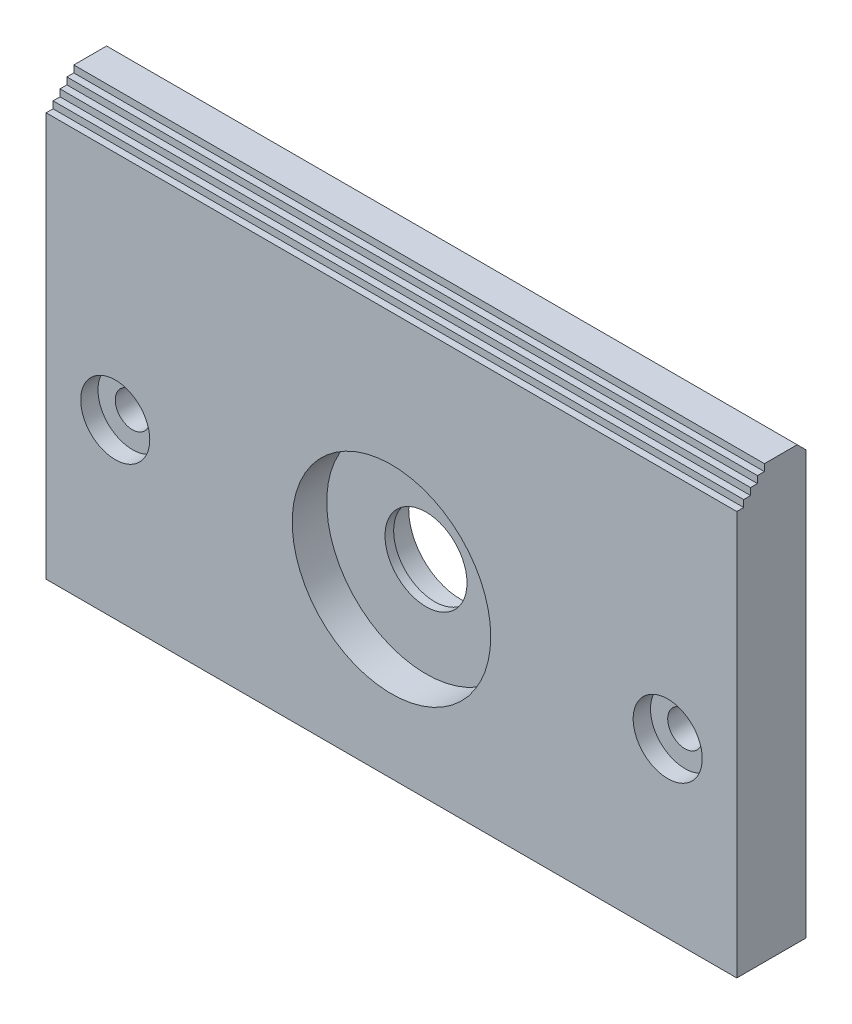
ISO-10303-21;
HEADER;
FILE_DESCRIPTION(('STEP AP214'),'2;1');
FILE_NAME('part.step','',(''),(''),'','','');
FILE_SCHEMA(('AUTOMOTIVE_DESIGN { 1 0 10303 214 1 1 1 1 }'));
ENDSEC;
DATA;
#1=APPLICATION_CONTEXT('core data for automotive mechanical design processes');
#2=APPLICATION_PROTOCOL_DEFINITION('international standard','automotive_design',2000,#1);
#3=PRODUCT_CONTEXT('',#1,'mechanical');
#4=PRODUCT('Part','Part','',(#3));
#5=PRODUCT_RELATED_PRODUCT_CATEGORY('part','',(#4));
#6=PRODUCT_DEFINITION_FORMATION('','',#4);
#7=PRODUCT_DEFINITION_CONTEXT('part definition',#1,'design');
#8=PRODUCT_DEFINITION('design','',#6,#7);
#9=PRODUCT_DEFINITION_SHAPE('','',#8);
#10=(LENGTH_UNIT() NAMED_UNIT(*) SI_UNIT(.MILLI.,.METRE.));
#11=(NAMED_UNIT(*) PLANE_ANGLE_UNIT() SI_UNIT($,.RADIAN.));
#12=(NAMED_UNIT(*) SI_UNIT($,.STERADIAN.) SOLID_ANGLE_UNIT());
#13=UNCERTAINTY_MEASURE_WITH_UNIT(LENGTH_MEASURE(1.E-05),#10,'distance_accuracy_value','');
#14=(GEOMETRIC_REPRESENTATION_CONTEXT(3) GLOBAL_UNCERTAINTY_ASSIGNED_CONTEXT((#13)) GLOBAL_UNIT_ASSIGNED_CONTEXT((#10,
#11,#12)) REPRESENTATION_CONTEXT('',''));
#15=CARTESIAN_POINT('',(0.,0.,0.));
#16=DIRECTION('',(0.,0.,1.));
#17=DIRECTION('',(1.,0.,0.));
#18=AXIS2_PLACEMENT_3D('',#15,#16,#17);
#19=CARTESIAN_POINT('',(40.,10.8333333333333,-0.0010000000000062));
#20=DIRECTION('',(0.,0.,1.));
#21=DIRECTION('',(1.,0.,0.));
#22=AXIS2_PLACEMENT_3D('',#19,#20,#21);
#23=CYLINDRICAL_SURFACE('',#22,4.75);
#24=CARTESIAN_POINT('',(40.,10.8333333333333,4.));
#25=DIRECTION('',(0.,0.,1.));
#26=DIRECTION('',(1.,0.,0.));
#27=AXIS2_PLACEMENT_3D('',#24,#25,#26);
#28=CIRCLE('',#27,4.75);
#29=CARTESIAN_POINT('',(44.75,10.8333333333333,4.));
#30=VERTEX_POINT('',#29);
#31=EDGE_CURVE('E296',#30,#30,#28,.F.);
#32=ORIENTED_EDGE('',*,*,#31,.F.);
#33=EDGE_LOOP('',(#32));
#34=FACE_BOUND('',#33,.T.);
#35=CARTESIAN_POINT('',(40.,10.8333333333333,3.));
#36=DIRECTION('',(0.,0.,-1.));
#37=DIRECTION('',(-1.,0.,0.));
#38=AXIS2_PLACEMENT_3D('',#35,#36,#37);
#39=CIRCLE('',#38,4.75);
#40=CARTESIAN_POINT('',(35.25,10.8333333333333,3.));
#41=VERTEX_POINT('',#40);
#42=EDGE_CURVE('E301',#41,#41,#39,.F.);
#43=ORIENTED_EDGE('',*,*,#42,.F.);
#44=EDGE_LOOP('',(#43));
#45=FACE_BOUND('',#44,.T.);
#46=ADVANCED_FACE('F163',(#34,#45),#23,.F.);
#47=CARTESIAN_POINT('',(80.,40.8333333333333,0.));
#48=DIRECTION('',(0.,1.,0.));
#49=DIRECTION('',(-1.,0.,0.));
#50=AXIS2_PLACEMENT_3D('',#47,#48,#49);
#51=PLANE('',#50);
#52=DIRECTION('',(-1.,0.,0.));
#53=VECTOR('',#52,1.);
#54=CARTESIAN_POINT('',(80.001,40.8333333333333,4.8));
#55=LINE('',#54,#53);
#56=CARTESIAN_POINT('',(80.,40.8333333333333,4.8));
#57=VERTEX_POINT('',#56);
#58=CARTESIAN_POINT('',(0.,40.8333333333333,4.8));
#59=VERTEX_POINT('',#58);
#60=EDGE_CURVE('E338',#57,#59,#55,.T.);
#61=ORIENTED_EDGE('',*,*,#60,.F.);
#62=DIRECTION('',(0.,0.,1.));
#63=VECTOR('',#62,1.);
#64=CARTESIAN_POINT('',(80.,40.8333333333333,0.));
#65=LINE('',#64,#63);
#66=CARTESIAN_POINT('',(80.,40.8333333333333,0.999999999999973));
#67=VERTEX_POINT('',#66);
#68=EDGE_CURVE('E293',#67,#57,#65,.T.);
#69=ORIENTED_EDGE('',*,*,#68,.F.);
#70=DIRECTION('',(-1.,0.,0.));
#71=VECTOR('',#70,1.);
#72=CARTESIAN_POINT('',(0.,40.8333333333333,0.999999999999973));
#73=LINE('',#72,#71);
#74=CARTESIAN_POINT('',(0.,40.8333333333333,0.999999999999973));
#75=VERTEX_POINT('',#74);
#76=EDGE_CURVE('E317',#67,#75,#73,.T.);
#77=ORIENTED_EDGE('',*,*,#76,.T.);
#78=DIRECTION('',(0.,0.,1.));
#79=VECTOR('',#78,1.);
#80=CARTESIAN_POINT('',(0.,40.8333333333333,0.));
#81=LINE('',#80,#79);
#82=EDGE_CURVE('E289',#75,#59,#81,.T.);
#83=ORIENTED_EDGE('',*,*,#82,.T.);
#84=EDGE_LOOP('',(#61,#69,#77,#83));
#85=FACE_BOUND('',#84,.T.);
#86=ADVANCED_FACE('F336',(#85),#51,.T.);
#87=CARTESIAN_POINT('',(0.,40.8333333333333,0.));
#88=DIRECTION('',(-1.,0.,0.));
#89=DIRECTION('',(0.,-1.,0.));
#90=AXIS2_PLACEMENT_3D('',#87,#88,#89);
#91=PLANE('',#90);
#92=DIRECTION('',(0.,0.,1.));
#93=VECTOR('',#92,1.);
#94=CARTESIAN_POINT('',(0.,37.6333333333333,7.2));
#95=LINE('',#94,#93);
#96=CARTESIAN_POINT('',(0.,37.6333333333333,7.2));
#97=VERTEX_POINT('',#96);
#98=CARTESIAN_POINT('',(0.,37.6333333333333,8.));
#99=VERTEX_POINT('',#98);
#100=EDGE_CURVE('E179',#97,#99,#95,.T.);
#101=ORIENTED_EDGE('',*,*,#100,.F.);
#102=DIRECTION('',(0.,-1.,0.));
#103=VECTOR('',#102,1.);
#104=CARTESIAN_POINT('',(0.,38.4333333333333,7.2));
#105=LINE('',#104,#103);
#106=CARTESIAN_POINT('',(0.,38.4333333333333,7.2));
#107=VERTEX_POINT('',#106);
#108=EDGE_CURVE('E346',#107,#97,#105,.T.);
#109=ORIENTED_EDGE('',*,*,#108,.F.);
#110=DIRECTION('',(0.,0.,1.));
#111=VECTOR('',#110,1.);
#112=CARTESIAN_POINT('',(0.,38.4333333333333,6.4));
#113=LINE('',#112,#111);
#114=CARTESIAN_POINT('',(0.,38.4333333333333,6.4));
#115=VERTEX_POINT('',#114);
#116=EDGE_CURVE('E400',#115,#107,#113,.T.);
#117=ORIENTED_EDGE('',*,*,#116,.F.);
#118=DIRECTION('',(0.,-1.,0.));
#119=VECTOR('',#118,1.);
#120=CARTESIAN_POINT('',(0.,39.2333333333333,6.4));
#121=LINE('',#120,#119);
#122=CARTESIAN_POINT('',(0.,39.2333333333333,6.4));
#123=VERTEX_POINT('',#122);
#124=EDGE_CURVE('E397',#123,#115,#121,.T.);
#125=ORIENTED_EDGE('',*,*,#124,.F.);
#126=DIRECTION('',(0.,0.,1.));
#127=VECTOR('',#126,1.);
#128=CARTESIAN_POINT('',(0.,39.2333333333333,5.6));
#129=LINE('',#128,#127);
#130=CARTESIAN_POINT('',(0.,39.2333333333333,5.6));
#131=VERTEX_POINT('',#130);
#132=EDGE_CURVE('E394',#131,#123,#129,.T.);
#133=ORIENTED_EDGE('',*,*,#132,.F.);
#134=DIRECTION('',(0.,-1.,0.));
#135=VECTOR('',#134,1.);
#136=CARTESIAN_POINT('',(0.,40.0333333333333,5.6));
#137=LINE('',#136,#135);
#138=CARTESIAN_POINT('',(0.,40.0333333333333,5.6));
#139=VERTEX_POINT('',#138);
#140=EDGE_CURVE('E388',#139,#131,#137,.T.);
#141=ORIENTED_EDGE('',*,*,#140,.F.);
#142=DIRECTION('',(0.,0.,1.));
#143=VECTOR('',#142,1.);
#144=CARTESIAN_POINT('',(0.,40.0333333333333,4.8));
#145=LINE('',#144,#143);
#146=CARTESIAN_POINT('',(0.,40.0333333333333,4.8));
#147=VERTEX_POINT('',#146);
#148=EDGE_CURVE('E385',#147,#139,#145,.T.);
#149=ORIENTED_EDGE('',*,*,#148,.F.);
#150=DIRECTION('',(0.,-1.,0.));
#151=VECTOR('',#150,1.);
#152=CARTESIAN_POINT('',(0.,40.8333333333333,4.8));
#153=LINE('',#152,#151);
#154=EDGE_CURVE('E270',#59,#147,#153,.T.);
#155=ORIENTED_EDGE('',*,*,#154,.F.);
#156=ORIENTED_EDGE('',*,*,#82,.F.);
#157=DIRECTION('',(0.,-0.707106781186552,-0.707106781186543));
#158=VECTOR('',#157,1.);
#159=CARTESIAN_POINT('',(0.,40.3333333333333,0.499999999999993));
#160=LINE('',#159,#158);
#161=CARTESIAN_POINT('',(0.,39.8333333333333,0.));
#162=VERTEX_POINT('',#161);
#163=EDGE_CURVE('E320',#75,#162,#160,.T.);
#164=ORIENTED_EDGE('',*,*,#163,.T.);
#165=DIRECTION('',(0.,-1.,0.));
#166=VECTOR('',#165,1.);
#167=CARTESIAN_POINT('',(0.,40.8333333333333,0.));
#168=LINE('',#167,#166);
#169=CARTESIAN_POINT('',(0.,-9.16666666666666,0.));
#170=VERTEX_POINT('',#169);
#171=EDGE_CURVE('E286',#162,#170,#168,.T.);
#172=ORIENTED_EDGE('',*,*,#171,.T.);
#173=DIRECTION('',(0.,0.,1.));
#174=VECTOR('',#173,1.);
#175=CARTESIAN_POINT('',(0.,-9.16666666666666,-0.000999999999999265));
#176=LINE('',#175,#174);
#177=CARTESIAN_POINT('',(0.,-9.16666666666666,8.));
#178=VERTEX_POINT('',#177);
#179=EDGE_CURVE('E355',#170,#178,#176,.T.);
#180=ORIENTED_EDGE('',*,*,#179,.T.);
#181=DIRECTION('',(0.,-1.,0.));
#182=VECTOR('',#181,1.);
#183=CARTESIAN_POINT('',(0.,40.8333333333333,8.));
#184=LINE('',#183,#182);
#185=EDGE_CURVE('E277',#99,#178,#184,.T.);
#186=ORIENTED_EDGE('',*,*,#185,.F.);
#187=EDGE_LOOP('',(#101,#109,#117,#125,#133,#141,#149,#155,#156,#164,#172,#180,#186));
#188=FACE_BOUND('',#187,.T.);
#189=ADVANCED_FACE('F381',(#188),#91,.T.);
#190=CARTESIAN_POINT('',(80.,-19.1666666666667,0.));
#191=DIRECTION('',(1.,0.,0.));
#192=DIRECTION('',(0.,0.,-1.));
#193=AXIS2_PLACEMENT_3D('',#190,#191,#192);
#194=PLANE('',#193);
#195=DIRECTION('',(0.,0.,1.));
#196=VECTOR('',#195,1.);
#197=CARTESIAN_POINT('',(80.,37.6333333333333,7.2));
#198=LINE('',#197,#196);
#199=CARTESIAN_POINT('',(80.,37.6333333333333,7.2));
#200=VERTEX_POINT('',#199);
#201=CARTESIAN_POINT('',(80.,37.6333333333333,8.));
#202=VERTEX_POINT('',#201);
#203=EDGE_CURVE('E259',#200,#202,#198,.T.);
#204=ORIENTED_EDGE('',*,*,#203,.T.);
#205=DIRECTION('',(0.,1.,0.));
#206=VECTOR('',#205,1.);
#207=CARTESIAN_POINT('',(80.,-19.1666666666667,8.));
#208=LINE('',#207,#206);
#209=CARTESIAN_POINT('',(80.,-9.16666666666666,8.));
#210=VERTEX_POINT('',#209);
#211=EDGE_CURVE('E187',#210,#202,#208,.T.);
#212=ORIENTED_EDGE('',*,*,#211,.F.);
#213=DIRECTION('',(0.,0.,1.));
#214=VECTOR('',#213,1.);
#215=CARTESIAN_POINT('',(80.,-9.16666666666666,-0.000999999999999265));
#216=LINE('',#215,#214);
#217=CARTESIAN_POINT('',(80.,-9.16666666666666,0.));
#218=VERTEX_POINT('',#217);
#219=EDGE_CURVE('E354',#218,#210,#216,.T.);
#220=ORIENTED_EDGE('',*,*,#219,.F.);
#221=DIRECTION('',(0.,1.,0.));
#222=VECTOR('',#221,1.);
#223=CARTESIAN_POINT('',(80.,-19.1666666666667,0.));
#224=LINE('',#223,#222);
#225=CARTESIAN_POINT('',(80.,39.8333333333334,0.));
#226=VERTEX_POINT('',#225);
#227=EDGE_CURVE('E280',#218,#226,#224,.T.);
#228=ORIENTED_EDGE('',*,*,#227,.T.);
#229=DIRECTION('',(0.,0.707106781186552,0.707106781186543));
#230=VECTOR('',#229,1.);
#231=CARTESIAN_POINT('',(80.,10.3333333333329,-29.5));
#232=LINE('',#231,#230);
#233=EDGE_CURVE('E12',#226,#67,#232,.T.);
#234=ORIENTED_EDGE('',*,*,#233,.T.);
#235=ORIENTED_EDGE('',*,*,#68,.T.);
#236=DIRECTION('',(0.,-1.,0.));
#237=VECTOR('',#236,1.);
#238=CARTESIAN_POINT('',(80.,40.8333333333333,4.8));
#239=LINE('',#238,#237);
#240=CARTESIAN_POINT('',(80.,40.0333333333333,4.8));
#241=VERTEX_POINT('',#240);
#242=EDGE_CURVE('E263',#57,#241,#239,.T.);
#243=ORIENTED_EDGE('',*,*,#242,.T.);
#244=DIRECTION('',(0.,0.,1.));
#245=VECTOR('',#244,1.);
#246=CARTESIAN_POINT('',(80.,40.0333333333333,4.8));
#247=LINE('',#246,#245);
#248=CARTESIAN_POINT('',(80.,40.0333333333333,5.6));
#249=VERTEX_POINT('',#248);
#250=EDGE_CURVE('E431',#241,#249,#247,.T.);
#251=ORIENTED_EDGE('',*,*,#250,.T.);
#252=DIRECTION('',(0.,-1.,0.));
#253=VECTOR('',#252,1.);
#254=CARTESIAN_POINT('',(80.,40.0333333333333,5.6));
#255=LINE('',#254,#253);
#256=CARTESIAN_POINT('',(80.,39.2333333333333,5.6));
#257=VERTEX_POINT('',#256);
#258=EDGE_CURVE('E419',#249,#257,#255,.T.);
#259=ORIENTED_EDGE('',*,*,#258,.T.);
#260=DIRECTION('',(0.,0.,1.));
#261=VECTOR('',#260,1.);
#262=CARTESIAN_POINT('',(80.,39.2333333333333,5.6));
#263=LINE('',#262,#261);
#264=CARTESIAN_POINT('',(80.,39.2333333333333,6.4));
#265=VERTEX_POINT('',#264);
#266=EDGE_CURVE('E429',#257,#265,#263,.T.);
#267=ORIENTED_EDGE('',*,*,#266,.T.);
#268=DIRECTION('',(0.,-1.,0.));
#269=VECTOR('',#268,1.);
#270=CARTESIAN_POINT('',(80.,39.2333333333333,6.4));
#271=LINE('',#270,#269);
#272=CARTESIAN_POINT('',(80.,38.4333333333333,6.4));
#273=VERTEX_POINT('',#272);
#274=EDGE_CURVE('E433',#265,#273,#271,.T.);
#275=ORIENTED_EDGE('',*,*,#274,.T.);
#276=DIRECTION('',(0.,0.,1.));
#277=VECTOR('',#276,1.);
#278=CARTESIAN_POINT('',(80.,38.4333333333333,6.4));
#279=LINE('',#278,#277);
#280=CARTESIAN_POINT('',(80.,38.4333333333333,7.2));
#281=VERTEX_POINT('',#280);
#282=EDGE_CURVE('E438',#273,#281,#279,.T.);
#283=ORIENTED_EDGE('',*,*,#282,.T.);
#284=DIRECTION('',(0.,-1.,0.));
#285=VECTOR('',#284,1.);
#286=CARTESIAN_POINT('',(80.,38.4333333333333,7.2));
#287=LINE('',#286,#285);
#288=EDGE_CURVE('E269',#281,#200,#287,.T.);
#289=ORIENTED_EDGE('',*,*,#288,.T.);
#290=EDGE_LOOP('',(#204,#212,#220,#228,#234,#235,#243,#251,#259,#267,#275,#283,#289));
#291=FACE_BOUND('',#290,.T.);
#292=ADVANCED_FACE('F267',(#291),#194,.T.);
#293=CARTESIAN_POINT('',(0.,0.,0.));
#294=DIRECTION('',(0.,0.,1.));
#295=DIRECTION('',(1.,0.,0.));
#296=AXIS2_PLACEMENT_3D('',#293,#294,#295);
#297=PLANE('',#296);
#298=CARTESIAN_POINT('',(72.,10.8333333333333,0.));
#299=DIRECTION('',(0.,0.,1.));
#300=DIRECTION('',(1.,0.,0.));
#301=AXIS2_PLACEMENT_3D('',#298,#299,#300);
#302=CIRCLE('',#301,3.50000000127192);
#303=CARTESIAN_POINT('',(75.5000000012719,10.8333333333333,0.));
#304=VERTEX_POINT('',#303);
#305=EDGE_CURVE('E308',#304,#304,#302,.T.);
#306=ORIENTED_EDGE('',*,*,#305,.T.);
#307=EDGE_LOOP('',(#306));
#308=FACE_BOUND('',#307,.T.);
#309=CARTESIAN_POINT('',(8.,10.8333333333333,0.));
#310=DIRECTION('',(0.,0.,1.));
#311=DIRECTION('',(1.,0.,0.));
#312=AXIS2_PLACEMENT_3D('',#309,#310,#311);
#313=CIRCLE('',#312,3.50000000127192);
#314=CARTESIAN_POINT('',(11.5000000012719,10.8333333333333,0.));
#315=VERTEX_POINT('',#314);
#316=EDGE_CURVE('E292',#315,#315,#313,.T.);
#317=ORIENTED_EDGE('',*,*,#316,.T.);
#318=EDGE_LOOP('',(#317));
#319=FACE_BOUND('',#318,.T.);
#320=CARTESIAN_POINT('',(40.,10.8333333333333,0.));
#321=DIRECTION('',(0.,0.,-1.));
#322=DIRECTION('',(-1.,0.,0.));
#323=AXIS2_PLACEMENT_3D('',#320,#321,#322);
#324=CIRCLE('',#323,6.);
#325=CARTESIAN_POINT('',(34.,10.8333333333333,0.));
#326=VERTEX_POINT('',#325);
#327=EDGE_CURVE('E358',#326,#326,#324,.T.);
#328=ORIENTED_EDGE('',*,*,#327,.F.);
#329=EDGE_LOOP('',(#328));
#330=FACE_BOUND('',#329,.T.);
#331=ORIENTED_EDGE('',*,*,#227,.F.);
#332=DIRECTION('',(1.,0.,0.));
#333=VECTOR('',#332,1.);
#334=CARTESIAN_POINT('',(0.,-9.16666666666666,0.));
#335=LINE('',#334,#333);
#336=EDGE_CURVE('E351',#170,#218,#335,.T.);
#337=ORIENTED_EDGE('',*,*,#336,.F.);
#338=ORIENTED_EDGE('',*,*,#171,.F.);
#339=DIRECTION('',(1.,0.,0.));
#340=VECTOR('',#339,1.);
#341=CARTESIAN_POINT('',(80.,39.8333333333334,0.));
#342=LINE('',#341,#340);
#343=EDGE_CURVE('E172',#162,#226,#342,.T.);
#344=ORIENTED_EDGE('',*,*,#343,.T.);
#345=EDGE_LOOP('',(#331,#337,#338,#344));
#346=FACE_BOUND('',#345,.T.);
#347=ADVANCED_FACE('F327',(#308,#319,#330,#346),#297,.F.);
#348=CARTESIAN_POINT('',(0.,0.,8.));
#349=DIRECTION('',(0.,0.,1.));
#350=DIRECTION('',(1.,0.,0.));
#351=AXIS2_PLACEMENT_3D('',#348,#349,#350);
#352=PLANE('',#351);
#353=DIRECTION('',(-1.,0.,0.));
#354=VECTOR('',#353,1.);
#355=CARTESIAN_POINT('',(80.001,37.6333333333333,8.));
#356=LINE('',#355,#354);
#357=EDGE_CURVE('E257',#202,#99,#356,.T.);
#358=ORIENTED_EDGE('',*,*,#357,.T.);
#359=ORIENTED_EDGE('',*,*,#185,.T.);
#360=DIRECTION('',(-1.,0.,0.));
#361=VECTOR('',#360,1.);
#362=CARTESIAN_POINT('',(0.,-9.16666666666666,8.));
#363=LINE('',#362,#361);
#364=EDGE_CURVE('E276',#210,#178,#363,.T.);
#365=ORIENTED_EDGE('',*,*,#364,.F.);
#366=ORIENTED_EDGE('',*,*,#211,.T.);
#367=EDGE_LOOP('',(#358,#359,#365,#366));
#368=FACE_BOUND('',#367,.T.);
#369=CARTESIAN_POINT('',(40.,10.8333333333333,8.));
#370=DIRECTION('',(0.,0.,1.));
#371=DIRECTION('',(1.,0.,0.));
#372=AXIS2_PLACEMENT_3D('',#369,#370,#371);
#373=CIRCLE('',#372,11.5);
#374=CARTESIAN_POINT('',(51.5,10.8333333333333,8.));
#375=VERTEX_POINT('',#374);
#376=EDGE_CURVE('E304',#375,#375,#373,.T.);
#377=ORIENTED_EDGE('',*,*,#376,.F.);
#378=EDGE_LOOP('',(#377));
#379=FACE_BOUND('',#378,.T.);
#380=CARTESIAN_POINT('',(8.,10.8333333333333,8.));
#381=DIRECTION('',(0.,0.,1.));
#382=DIRECTION('',(1.,0.,0.));
#383=AXIS2_PLACEMENT_3D('',#380,#381,#382);
#384=CIRCLE('',#383,4.);
#385=CARTESIAN_POINT('',(12.,10.8333333333333,8.));
#386=VERTEX_POINT('',#385);
#387=EDGE_CURVE('E299',#386,#386,#384,.T.);
#388=ORIENTED_EDGE('',*,*,#387,.F.);
#389=EDGE_LOOP('',(#388));
#390=FACE_BOUND('',#389,.T.);
#391=CARTESIAN_POINT('',(72.,10.8333333333333,8.));
#392=DIRECTION('',(0.,0.,1.));
#393=DIRECTION('',(1.,0.,0.));
#394=AXIS2_PLACEMENT_3D('',#391,#392,#393);
#395=CIRCLE('',#394,4.);
#396=CARTESIAN_POINT('',(76.,10.8333333333333,8.));
#397=VERTEX_POINT('',#396);
#398=EDGE_CURVE('E376',#397,#397,#395,.T.);
#399=ORIENTED_EDGE('',*,*,#398,.F.);
#400=EDGE_LOOP('',(#399));
#401=FACE_BOUND('',#400,.T.);
#402=ADVANCED_FACE('F273',(#368,#379,#390,#401),#352,.T.);
#403=CARTESIAN_POINT('',(72.,10.8333333333333,8.));
#404=DIRECTION('',(0.,0.,1.));
#405=DIRECTION('',(1.,0.,0.));
#406=AXIS2_PLACEMENT_3D('',#403,#404,#405);
#407=CYLINDRICAL_SURFACE('',#406,2.00000000000002);
#408=CARTESIAN_POINT('',(72.,10.8333333333333,1.49999999854342));
#409=DIRECTION('',(0.,0.,1.));
#410=DIRECTION('',(1.,0.,0.));
#411=AXIS2_PLACEMENT_3D('',#408,#409,#410);
#412=CIRCLE('',#411,2.00000000000002);
#413=CARTESIAN_POINT('',(74.,10.8333333333333,1.49999999854342));
#414=VERTEX_POINT('',#413);
#415=EDGE_CURVE('E311',#414,#414,#412,.F.);
#416=ORIENTED_EDGE('',*,*,#415,.T.);
#417=EDGE_LOOP('',(#416));
#418=FACE_BOUND('',#417,.T.);
#419=CARTESIAN_POINT('',(72.,10.8333333333333,6.));
#420=DIRECTION('',(0.,0.,1.));
#421=DIRECTION('',(1.,0.,0.));
#422=AXIS2_PLACEMENT_3D('',#419,#420,#421);
#423=CIRCLE('',#422,2.00000000000002);
#424=CARTESIAN_POINT('',(74.,10.8333333333333,6.));
#425=VERTEX_POINT('',#424);
#426=EDGE_CURVE('E278',#425,#425,#423,.T.);
#427=ORIENTED_EDGE('',*,*,#426,.T.);
#428=EDGE_LOOP('',(#427));
#429=FACE_BOUND('',#428,.T.);
#430=ADVANCED_FACE('F490',(#418,#429),#407,.F.);
#431=CARTESIAN_POINT('',(74.,10.8333333333333,6.));
#432=DIRECTION('',(0.,0.,-1.));
#433=DIRECTION('',(-1.,0.,0.));
#434=AXIS2_PLACEMENT_3D('',#431,#432,#433);
#435=PLANE('',#434);
#436=ORIENTED_EDGE('',*,*,#426,.F.);
#437=EDGE_LOOP('',(#436));
#438=FACE_BOUND('',#437,.T.);
#439=CARTESIAN_POINT('',(72.,10.8333333333333,6.));
#440=DIRECTION('',(0.,0.,1.));
#441=DIRECTION('',(1.,0.,0.));
#442=AXIS2_PLACEMENT_3D('',#439,#440,#441);
#443=CIRCLE('',#442,4.);
#444=CARTESIAN_POINT('',(76.,10.8333333333333,6.));
#445=VERTEX_POINT('',#444);
#446=EDGE_CURVE('E283',#445,#445,#443,.T.);
#447=ORIENTED_EDGE('',*,*,#446,.T.);
#448=EDGE_LOOP('',(#447));
#449=FACE_BOUND('',#448,.T.);
#450=ADVANCED_FACE('F486',(#438,#449),#435,.F.);
#451=CARTESIAN_POINT('',(72.,10.8333333333333,8.));
#452=DIRECTION('',(0.,0.,1.));
#453=DIRECTION('',(1.,0.,0.));
#454=AXIS2_PLACEMENT_3D('',#451,#452,#453);
#455=CYLINDRICAL_SURFACE('',#454,4.);
#456=ORIENTED_EDGE('',*,*,#446,.F.);
#457=EDGE_LOOP('',(#456));
#458=FACE_BOUND('',#457,.T.);
#459=ORIENTED_EDGE('',*,*,#398,.T.);
#460=EDGE_LOOP('',(#459));
#461=FACE_BOUND('',#460,.T.);
#462=ADVANCED_FACE('F482',(#458,#461),#455,.F.);
#463=CARTESIAN_POINT('',(8.,10.8333333333333,8.));
#464=DIRECTION('',(0.,0.,1.));
#465=DIRECTION('',(1.,0.,0.));
#466=AXIS2_PLACEMENT_3D('',#463,#464,#465);
#467=CYLINDRICAL_SURFACE('',#466,2.00000000000001);
#468=CARTESIAN_POINT('',(8.,10.8333333333333,1.49999999854344));
#469=DIRECTION('',(0.,0.,1.));
#470=DIRECTION('',(1.,0.,0.));
#471=AXIS2_PLACEMENT_3D('',#468,#469,#470);
#472=CIRCLE('',#471,2.00000000000001);
#473=CARTESIAN_POINT('',(10.,10.8333333333333,1.49999999854344));
#474=VERTEX_POINT('',#473);
#475=EDGE_CURVE('E314',#474,#474,#472,.F.);
#476=ORIENTED_EDGE('',*,*,#475,.T.);
#477=EDGE_LOOP('',(#476));
#478=FACE_BOUND('',#477,.T.);
#479=CARTESIAN_POINT('',(8.,10.8333333333333,6.));
#480=DIRECTION('',(0.,0.,1.));
#481=DIRECTION('',(1.,0.,0.));
#482=AXIS2_PLACEMENT_3D('',#479,#480,#481);
#483=CIRCLE('',#482,2.00000000000001);
#484=CARTESIAN_POINT('',(10.,10.8333333333333,6.));
#485=VERTEX_POINT('',#484);
#486=EDGE_CURVE('E373',#485,#485,#483,.T.);
#487=ORIENTED_EDGE('',*,*,#486,.T.);
#488=EDGE_LOOP('',(#487));
#489=FACE_BOUND('',#488,.T.);
#490=ADVANCED_FACE('F478',(#478,#489),#467,.F.);
#491=CARTESIAN_POINT('',(10.,10.8333333333333,6.));
#492=DIRECTION('',(0.,0.,-1.));
#493=DIRECTION('',(-1.,0.,0.));
#494=AXIS2_PLACEMENT_3D('',#491,#492,#493);
#495=PLANE('',#494);
#496=ORIENTED_EDGE('',*,*,#486,.F.);
#497=EDGE_LOOP('',(#496));
#498=FACE_BOUND('',#497,.T.);
#499=CARTESIAN_POINT('',(8.,10.8333333333333,6.));
#500=DIRECTION('',(0.,0.,1.));
#501=DIRECTION('',(1.,0.,0.));
#502=AXIS2_PLACEMENT_3D('',#499,#500,#501);
#503=CIRCLE('',#502,4.);
#504=CARTESIAN_POINT('',(12.,10.8333333333333,6.));
#505=VERTEX_POINT('',#504);
#506=EDGE_CURVE('E370',#505,#505,#503,.T.);
#507=ORIENTED_EDGE('',*,*,#506,.T.);
#508=EDGE_LOOP('',(#507));
#509=FACE_BOUND('',#508,.T.);
#510=ADVANCED_FACE('F474',(#498,#509),#495,.F.);
#511=CARTESIAN_POINT('',(8.,10.8333333333333,8.));
#512=DIRECTION('',(0.,0.,1.));
#513=DIRECTION('',(1.,0.,0.));
#514=AXIS2_PLACEMENT_3D('',#511,#512,#513);
#515=CYLINDRICAL_SURFACE('',#514,4.);
#516=ORIENTED_EDGE('',*,*,#506,.F.);
#517=EDGE_LOOP('',(#516));
#518=FACE_BOUND('',#517,.T.);
#519=ORIENTED_EDGE('',*,*,#387,.T.);
#520=EDGE_LOOP('',(#519));
#521=FACE_BOUND('',#520,.T.);
#522=ADVANCED_FACE('F470',(#518,#521),#515,.F.);
#523=CARTESIAN_POINT('',(40.,10.8333333333333,4.));
#524=DIRECTION('',(0.,0.,1.));
#525=DIRECTION('',(1.,0.,0.));
#526=AXIS2_PLACEMENT_3D('',#523,#524,#525);
#527=PLANE('',#526);
#528=CARTESIAN_POINT('',(40.,10.8333333333333,4.));
#529=DIRECTION('',(0.,0.,1.));
#530=DIRECTION('',(1.,0.,0.));
#531=AXIS2_PLACEMENT_3D('',#528,#529,#530);
#532=CIRCLE('',#531,11.5);
#533=CARTESIAN_POINT('',(51.5,10.8333333333333,4.));
#534=VERTEX_POINT('',#533);
#535=EDGE_CURVE('E300',#534,#534,#532,.T.);
#536=ORIENTED_EDGE('',*,*,#535,.T.);
#537=EDGE_LOOP('',(#536));
#538=FACE_BOUND('',#537,.T.);
#539=ORIENTED_EDGE('',*,*,#31,.T.);
#540=EDGE_LOOP('',(#539));
#541=FACE_BOUND('',#540,.T.);
#542=ADVANCED_FACE('F473',(#538,#541),#527,.T.);
#543=CARTESIAN_POINT('',(40.,10.8333333333333,4.));
#544=DIRECTION('',(0.,0.,1.));
#545=DIRECTION('',(1.,0.,0.));
#546=AXIS2_PLACEMENT_3D('',#543,#544,#545);
#547=CYLINDRICAL_SURFACE('',#546,11.5);
#548=ORIENTED_EDGE('',*,*,#535,.F.);
#549=EDGE_LOOP('',(#548));
#550=FACE_BOUND('',#549,.T.);
#551=ORIENTED_EDGE('',*,*,#376,.T.);
#552=EDGE_LOOP('',(#551));
#553=FACE_BOUND('',#552,.T.);
#554=ADVANCED_FACE('F468',(#550,#553),#547,.F.);
#555=CARTESIAN_POINT('',(40.,10.8333333333333,3.));
#556=DIRECTION('',(0.,0.,-1.));
#557=DIRECTION('',(-1.,0.,0.));
#558=AXIS2_PLACEMENT_3D('',#555,#556,#557);
#559=PLANE('',#558);
#560=CARTESIAN_POINT('',(40.,10.8333333333333,3.));
#561=DIRECTION('',(0.,0.,-1.));
#562=DIRECTION('',(-1.,0.,0.));
#563=AXIS2_PLACEMENT_3D('',#560,#561,#562);
#564=CIRCLE('',#563,6.);
#565=CARTESIAN_POINT('',(34.,10.8333333333333,3.));
#566=VERTEX_POINT('',#565);
#567=EDGE_CURVE('E305',#566,#566,#564,.T.);
#568=ORIENTED_EDGE('',*,*,#567,.T.);
#569=EDGE_LOOP('',(#568));
#570=FACE_BOUND('',#569,.T.);
#571=ORIENTED_EDGE('',*,*,#42,.T.);
#572=EDGE_LOOP('',(#571));
#573=FACE_BOUND('',#572,.T.);
#574=ADVANCED_FACE('F528',(#570,#573),#559,.T.);
#575=CARTESIAN_POINT('',(40.,10.8333333333333,3.));
#576=DIRECTION('',(0.,0.,-1.));
#577=DIRECTION('',(-1.,0.,0.));
#578=AXIS2_PLACEMENT_3D('',#575,#576,#577);
#579=CYLINDRICAL_SURFACE('',#578,6.);
#580=ORIENTED_EDGE('',*,*,#567,.F.);
#581=EDGE_LOOP('',(#580));
#582=FACE_BOUND('',#581,.T.);
#583=ORIENTED_EDGE('',*,*,#327,.T.);
#584=EDGE_LOOP('',(#583));
#585=FACE_BOUND('',#584,.T.);
#586=ADVANCED_FACE('F511',(#582,#585),#579,.F.);
#587=CARTESIAN_POINT('',(72.,10.8333333333333,0.));
#588=DIRECTION('',(0.,0.,-1.));
#589=DIRECTION('',(-1.,0.,0.));
#590=AXIS2_PLACEMENT_3D('',#587,#588,#589);
#591=CONICAL_SURFACE('',#590,3.50000000127192,0.785398164306943);
#592=ORIENTED_EDGE('',*,*,#415,.F.);
#593=EDGE_LOOP('',(#592));
#594=FACE_BOUND('',#593,.T.);
#595=ORIENTED_EDGE('',*,*,#305,.F.);
#596=EDGE_LOOP('',(#595));
#597=FACE_BOUND('',#596,.T.);
#598=ADVANCED_FACE('F505',(#594,#597),#591,.F.);
#599=CARTESIAN_POINT('',(8.,10.8333333333333,0.));
#600=DIRECTION('',(0.,0.,-1.));
#601=DIRECTION('',(-1.,0.,0.));
#602=AXIS2_PLACEMENT_3D('',#599,#600,#601);
#603=CONICAL_SURFACE('',#602,3.50000000127192,0.785398164306938);
#604=ORIENTED_EDGE('',*,*,#475,.F.);
#605=EDGE_LOOP('',(#604));
#606=FACE_BOUND('',#605,.T.);
#607=ORIENTED_EDGE('',*,*,#316,.F.);
#608=EDGE_LOOP('',(#607));
#609=FACE_BOUND('',#608,.T.);
#610=ADVANCED_FACE('F510',(#606,#609),#603,.F.);
#611=CARTESIAN_POINT('',(80.,40.8333333333333,0.999999999999973));
#612=DIRECTION('',(0.,0.707106781186543,-0.707106781186552));
#613=DIRECTION('',(1.,0.,0.));
#614=AXIS2_PLACEMENT_3D('',#611,#612,#613);
#615=PLANE('',#614);
#616=ORIENTED_EDGE('',*,*,#233,.F.);
#617=ORIENTED_EDGE('',*,*,#343,.F.);
#618=ORIENTED_EDGE('',*,*,#163,.F.);
#619=ORIENTED_EDGE('',*,*,#76,.F.);
#620=EDGE_LOOP('',(#616,#617,#618,#619));
#621=FACE_BOUND('',#620,.T.);
#622=ADVANCED_FACE('F166',(#621),#615,.T.);
#623=CARTESIAN_POINT('',(0.,-9.16666666666666,-0.000999999999999265));
#624=DIRECTION('',(0.,1.,0.));
#625=DIRECTION('',(0.,0.,1.));
#626=AXIS2_PLACEMENT_3D('',#623,#624,#625);
#627=PLANE('',#626);
#628=ORIENTED_EDGE('',*,*,#336,.T.);
#629=ORIENTED_EDGE('',*,*,#219,.T.);
#630=ORIENTED_EDGE('',*,*,#364,.T.);
#631=ORIENTED_EDGE('',*,*,#179,.F.);
#632=EDGE_LOOP('',(#628,#629,#630,#631));
#633=FACE_BOUND('',#632,.T.);
#634=ADVANCED_FACE('F455',(#633),#627,.F.);
#635=CARTESIAN_POINT('',(80.001,37.6333333333333,7.2));
#636=DIRECTION('',(0.,-1.,0.));
#637=DIRECTION('',(1.,0.,0.));
#638=AXIS2_PLACEMENT_3D('',#635,#636,#637);
#639=PLANE('',#638);
#640=DIRECTION('',(-1.,0.,0.));
#641=VECTOR('',#640,1.);
#642=CARTESIAN_POINT('',(80.001,37.6333333333333,7.2));
#643=LINE('',#642,#641);
#644=EDGE_CURVE('E264',#200,#97,#643,.T.);
#645=ORIENTED_EDGE('',*,*,#644,.T.);
#646=ORIENTED_EDGE('',*,*,#100,.T.);
#647=ORIENTED_EDGE('',*,*,#357,.F.);
#648=ORIENTED_EDGE('',*,*,#203,.F.);
#649=EDGE_LOOP('',(#645,#646,#647,#648));
#650=FACE_BOUND('',#649,.T.);
#651=ADVANCED_FACE('F258',(#650),#639,.F.);
#652=CARTESIAN_POINT('',(80.001,38.4333333333333,7.2));
#653=DIRECTION('',(0.,0.,-1.));
#654=DIRECTION('',(0.,1.,0.));
#655=AXIS2_PLACEMENT_3D('',#652,#653,#654);
#656=PLANE('',#655);
#657=DIRECTION('',(-1.,0.,0.));
#658=VECTOR('',#657,1.);
#659=CARTESIAN_POINT('',(80.001,38.4333333333333,7.2));
#660=LINE('',#659,#658);
#661=EDGE_CURVE('E406',#281,#107,#660,.T.);
#662=ORIENTED_EDGE('',*,*,#661,.T.);
#663=ORIENTED_EDGE('',*,*,#108,.T.);
#664=ORIENTED_EDGE('',*,*,#644,.F.);
#665=ORIENTED_EDGE('',*,*,#288,.F.);
#666=EDGE_LOOP('',(#662,#663,#664,#665));
#667=FACE_BOUND('',#666,.T.);
#668=ADVANCED_FACE('F447',(#667),#656,.F.);
#669=CARTESIAN_POINT('',(80.001,38.4333333333333,6.4));
#670=DIRECTION('',(0.,-1.,0.));
#671=DIRECTION('',(1.,0.,0.));
#672=AXIS2_PLACEMENT_3D('',#669,#670,#671);
#673=PLANE('',#672);
#674=DIRECTION('',(-1.,0.,0.));
#675=VECTOR('',#674,1.);
#676=CARTESIAN_POINT('',(80.001,38.4333333333333,6.4));
#677=LINE('',#676,#675);
#678=EDGE_CURVE('E408',#273,#115,#677,.T.);
#679=ORIENTED_EDGE('',*,*,#678,.T.);
#680=ORIENTED_EDGE('',*,*,#116,.T.);
#681=ORIENTED_EDGE('',*,*,#661,.F.);
#682=ORIENTED_EDGE('',*,*,#282,.F.);
#683=EDGE_LOOP('',(#679,#680,#681,#682));
#684=FACE_BOUND('',#683,.T.);
#685=ADVANCED_FACE('F442',(#684),#673,.F.);
#686=CARTESIAN_POINT('',(80.001,39.2333333333333,6.4));
#687=DIRECTION('',(0.,0.,-1.));
#688=DIRECTION('',(0.,1.,0.));
#689=AXIS2_PLACEMENT_3D('',#686,#687,#688);
#690=PLANE('',#689);
#691=DIRECTION('',(-1.,0.,0.));
#692=VECTOR('',#691,1.);
#693=CARTESIAN_POINT('',(80.001,39.2333333333333,6.4));
#694=LINE('',#693,#692);
#695=EDGE_CURVE('E410',#265,#123,#694,.T.);
#696=ORIENTED_EDGE('',*,*,#695,.T.);
#697=ORIENTED_EDGE('',*,*,#124,.T.);
#698=ORIENTED_EDGE('',*,*,#678,.F.);
#699=ORIENTED_EDGE('',*,*,#274,.F.);
#700=EDGE_LOOP('',(#696,#697,#698,#699));
#701=FACE_BOUND('',#700,.T.);
#702=ADVANCED_FACE('F444',(#701),#690,.F.);
#703=CARTESIAN_POINT('',(80.001,39.2333333333333,5.6));
#704=DIRECTION('',(0.,-1.,0.));
#705=DIRECTION('',(1.,0.,0.));
#706=AXIS2_PLACEMENT_3D('',#703,#704,#705);
#707=PLANE('',#706);
#708=DIRECTION('',(-1.,0.,0.));
#709=VECTOR('',#708,1.);
#710=CARTESIAN_POINT('',(80.001,39.2333333333333,5.6));
#711=LINE('',#710,#709);
#712=EDGE_CURVE('E412',#257,#131,#711,.T.);
#713=ORIENTED_EDGE('',*,*,#712,.T.);
#714=ORIENTED_EDGE('',*,*,#132,.T.);
#715=ORIENTED_EDGE('',*,*,#695,.F.);
#716=ORIENTED_EDGE('',*,*,#266,.F.);
#717=EDGE_LOOP('',(#713,#714,#715,#716));
#718=FACE_BOUND('',#717,.T.);
#719=ADVANCED_FACE('F427',(#718),#707,.F.);
#720=CARTESIAN_POINT('',(80.001,40.0333333333333,5.6));
#721=DIRECTION('',(0.,0.,-1.));
#722=DIRECTION('',(-1.,0.,0.));
#723=AXIS2_PLACEMENT_3D('',#720,#721,#722);
#724=PLANE('',#723);
#725=DIRECTION('',(-1.,0.,0.));
#726=VECTOR('',#725,1.);
#727=CARTESIAN_POINT('',(80.001,40.0333333333333,5.6));
#728=LINE('',#727,#726);
#729=EDGE_CURVE('E344',#249,#139,#728,.T.);
#730=ORIENTED_EDGE('',*,*,#729,.T.);
#731=ORIENTED_EDGE('',*,*,#140,.T.);
#732=ORIENTED_EDGE('',*,*,#712,.F.);
#733=ORIENTED_EDGE('',*,*,#258,.F.);
#734=EDGE_LOOP('',(#730,#731,#732,#733));
#735=FACE_BOUND('',#734,.T.);
#736=ADVANCED_FACE('F415',(#735),#724,.F.);
#737=CARTESIAN_POINT('',(80.001,40.0333333333333,4.8));
#738=DIRECTION('',(0.,-1.,0.));
#739=DIRECTION('',(1.,0.,0.));
#740=AXIS2_PLACEMENT_3D('',#737,#738,#739);
#741=PLANE('',#740);
#742=DIRECTION('',(-1.,0.,0.));
#743=VECTOR('',#742,1.);
#744=CARTESIAN_POINT('',(80.001,40.0333333333333,4.8));
#745=LINE('',#744,#743);
#746=EDGE_CURVE('E342',#241,#147,#745,.T.);
#747=ORIENTED_EDGE('',*,*,#746,.T.);
#748=ORIENTED_EDGE('',*,*,#148,.T.);
#749=ORIENTED_EDGE('',*,*,#729,.F.);
#750=ORIENTED_EDGE('',*,*,#250,.F.);
#751=EDGE_LOOP('',(#747,#748,#749,#750));
#752=FACE_BOUND('',#751,.T.);
#753=ADVANCED_FACE('F422',(#752),#741,.F.);
#754=CARTESIAN_POINT('',(80.001,40.8333333333333,4.8));
#755=DIRECTION('',(0.,0.,-1.));
#756=DIRECTION('',(-1.,0.,0.));
#757=AXIS2_PLACEMENT_3D('',#754,#755,#756);
#758=PLANE('',#757);
#759=ORIENTED_EDGE('',*,*,#60,.T.);
#760=ORIENTED_EDGE('',*,*,#154,.T.);
#761=ORIENTED_EDGE('',*,*,#746,.F.);
#762=ORIENTED_EDGE('',*,*,#242,.F.);
#763=EDGE_LOOP('',(#759,#760,#761,#762));
#764=FACE_BOUND('',#763,.T.);
#765=ADVANCED_FACE('F702',(#764),#758,.F.);
#766=CLOSED_SHELL('',(#46,#86,#189,#292,#347,#402,#430,#450,#462,#490,#510,#522,#542,#554,#574,
#586,#598,#610,#622,#634,#651,#668,#685,#702,#719,#736,#753,#765));
#767=MANIFOLD_SOLID_BREP('B2',#766);
#768=ADVANCED_BREP_SHAPE_REPRESENTATION('',(#18,#767),#14);
#769=SHAPE_DEFINITION_REPRESENTATION(#9,#768);
ENDSEC;
END-ISO-10303-21;
